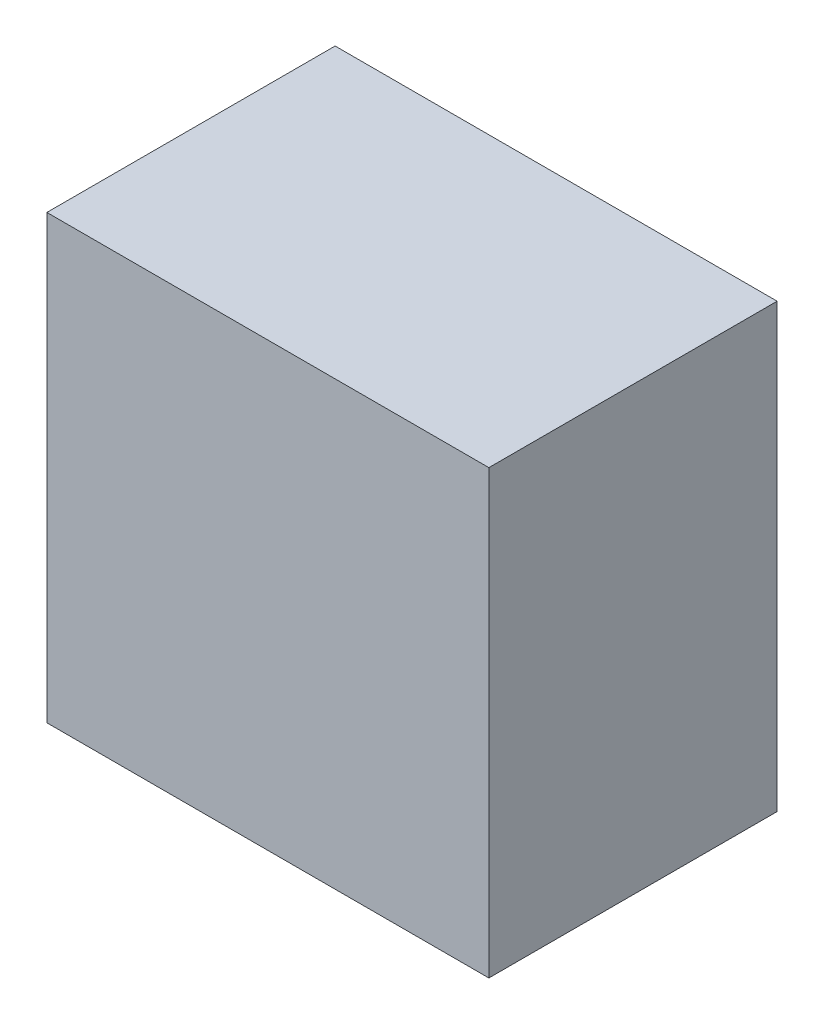
ISO-10303-21;
HEADER;
FILE_DESCRIPTION(('STEP AP214'),'2;1');
FILE_NAME('part.step','',(''),(''),'','','');
FILE_SCHEMA(('AUTOMOTIVE_DESIGN { 1 0 10303 214 1 1 1 1 }'));
ENDSEC;
DATA;
#1=APPLICATION_CONTEXT('core data for automotive mechanical design processes');
#2=APPLICATION_PROTOCOL_DEFINITION('international standard','automotive_design',2000,#1);
#3=PRODUCT_CONTEXT('',#1,'mechanical');
#4=PRODUCT('Part','Part','',(#3));
#5=PRODUCT_RELATED_PRODUCT_CATEGORY('part','',(#4));
#6=PRODUCT_DEFINITION_FORMATION('','',#4);
#7=PRODUCT_DEFINITION_CONTEXT('part definition',#1,'design');
#8=PRODUCT_DEFINITION('design','',#6,#7);
#9=PRODUCT_DEFINITION_SHAPE('','',#8);
#10=(LENGTH_UNIT() NAMED_UNIT(*) SI_UNIT(.MILLI.,.METRE.));
#11=(NAMED_UNIT(*) PLANE_ANGLE_UNIT() SI_UNIT($,.RADIAN.));
#12=(NAMED_UNIT(*) SI_UNIT($,.STERADIAN.) SOLID_ANGLE_UNIT());
#13=UNCERTAINTY_MEASURE_WITH_UNIT(LENGTH_MEASURE(1.E-05),#10,'distance_accuracy_value','');
#14=(GEOMETRIC_REPRESENTATION_CONTEXT(3) GLOBAL_UNCERTAINTY_ASSIGNED_CONTEXT((#13)) GLOBAL_UNIT_ASSIGNED_CONTEXT((#10,
#11,#12)) REPRESENTATION_CONTEXT('',''));
#15=CARTESIAN_POINT('',(0.,0.,0.));
#16=DIRECTION('',(0.,0.,1.));
#17=DIRECTION('',(1.,0.,0.));
#18=AXIS2_PLACEMENT_3D('',#15,#16,#17);
#19=CARTESIAN_POINT('',(2.921,2.921,0.));
#20=DIRECTION('',(0.,0.,-1.));
#21=DIRECTION('',(-1.,0.,0.));
#22=AXIS2_PLACEMENT_3D('',#19,#20,#21);
#23=PLANE('',#22);
#24=DIRECTION('',(1.,0.,0.));
#25=VECTOR('',#24,1.);
#26=CARTESIAN_POINT('',(2.921,-2.921,0.));
#27=LINE('',#26,#25);
#28=CARTESIAN_POINT('',(-2.921,-2.921,0.));
#29=VERTEX_POINT('',#28);
#30=CARTESIAN_POINT('',(2.921,-2.921,0.));
#31=VERTEX_POINT('',#30);
#32=EDGE_CURVE('E54',#29,#31,#27,.T.);
#33=ORIENTED_EDGE('',*,*,#32,.F.);
#34=DIRECTION('',(0.,1.,0.));
#35=VECTOR('',#34,1.);
#36=CARTESIAN_POINT('',(-2.921,-2.921,0.));
#37=LINE('',#36,#35);
#38=CARTESIAN_POINT('',(-2.921,2.921,0.));
#39=VERTEX_POINT('',#38);
#40=EDGE_CURVE('E19',#39,#29,#37,.F.);
#41=ORIENTED_EDGE('',*,*,#40,.F.);
#42=DIRECTION('',(1.,0.,0.));
#43=VECTOR('',#42,1.);
#44=CARTESIAN_POINT('',(-2.921,2.921,0.));
#45=LINE('',#44,#43);
#46=CARTESIAN_POINT('',(2.921,2.921,0.));
#47=VERTEX_POINT('',#46);
#48=EDGE_CURVE('E79',#47,#39,#45,.F.);
#49=ORIENTED_EDGE('',*,*,#48,.F.);
#50=DIRECTION('',(0.,1.,0.));
#51=VECTOR('',#50,1.);
#52=CARTESIAN_POINT('',(2.921,2.921,0.));
#53=LINE('',#52,#51);
#54=EDGE_CURVE('E67',#31,#47,#53,.T.);
#55=ORIENTED_EDGE('',*,*,#54,.F.);
#56=EDGE_LOOP('',(#33,#41,#49,#55));
#57=FACE_BOUND('',#56,.T.);
#58=ADVANCED_FACE('F16',(#57),#23,.T.);
#59=CARTESIAN_POINT('',(-2.921,-2.921,3.81));
#60=DIRECTION('',(-1.,0.,0.));
#61=DIRECTION('',(0.,0.,1.));
#62=AXIS2_PLACEMENT_3D('',#59,#60,#61);
#63=PLANE('',#62);
#64=ORIENTED_EDGE('',*,*,#40,.T.);
#65=DIRECTION('',(0.,0.,-1.));
#66=VECTOR('',#65,1.);
#67=CARTESIAN_POINT('',(-2.921,-2.921,3.81));
#68=LINE('',#67,#66);
#69=CARTESIAN_POINT('',(-2.921,-2.921,3.81));
#70=VERTEX_POINT('',#69);
#71=EDGE_CURVE('E60',#70,#29,#68,.T.);
#72=ORIENTED_EDGE('',*,*,#71,.F.);
#73=DIRECTION('',(0.,1.,0.));
#74=VECTOR('',#73,1.);
#75=CARTESIAN_POINT('',(-2.921,2.921,3.81));
#76=LINE('',#75,#74);
#77=CARTESIAN_POINT('',(-2.921,2.921,3.81));
#78=VERTEX_POINT('',#77);
#79=EDGE_CURVE('E82',#78,#70,#76,.F.);
#80=ORIENTED_EDGE('',*,*,#79,.F.);
#81=DIRECTION('',(0.,0.,1.));
#82=VECTOR('',#81,1.);
#83=CARTESIAN_POINT('',(-2.921,2.921,3.81));
#84=LINE('',#83,#82);
#85=EDGE_CURVE('E63',#39,#78,#84,.T.);
#86=ORIENTED_EDGE('',*,*,#85,.F.);
#87=EDGE_LOOP('',(#64,#72,#80,#86));
#88=FACE_BOUND('',#87,.T.);
#89=ADVANCED_FACE('F59',(#88),#63,.T.);
#90=CARTESIAN_POINT('',(2.921,-2.921,3.81));
#91=DIRECTION('',(0.,-1.,0.));
#92=DIRECTION('',(0.,0.,-1.));
#93=AXIS2_PLACEMENT_3D('',#90,#91,#92);
#94=PLANE('',#93);
#95=ORIENTED_EDGE('',*,*,#32,.T.);
#96=DIRECTION('',(0.,0.,-1.));
#97=VECTOR('',#96,1.);
#98=CARTESIAN_POINT('',(2.921,-2.921,3.81));
#99=LINE('',#98,#97);
#100=CARTESIAN_POINT('',(2.921,-2.921,3.81));
#101=VERTEX_POINT('',#100);
#102=EDGE_CURVE('E69',#101,#31,#99,.T.);
#103=ORIENTED_EDGE('',*,*,#102,.F.);
#104=DIRECTION('',(1.,0.,0.));
#105=VECTOR('',#104,1.);
#106=CARTESIAN_POINT('',(2.921,-2.921,3.81));
#107=LINE('',#106,#105);
#108=EDGE_CURVE('E73',#70,#101,#107,.T.);
#109=ORIENTED_EDGE('',*,*,#108,.F.);
#110=ORIENTED_EDGE('',*,*,#71,.T.);
#111=EDGE_LOOP('',(#95,#103,#109,#110));
#112=FACE_BOUND('',#111,.T.);
#113=ADVANCED_FACE('F71',(#112),#94,.T.);
#114=CARTESIAN_POINT('',(2.921,2.921,3.81));
#115=DIRECTION('',(1.,0.,0.));
#116=DIRECTION('',(0.,0.,-1.));
#117=AXIS2_PLACEMENT_3D('',#114,#115,#116);
#118=PLANE('',#117);
#119=ORIENTED_EDGE('',*,*,#54,.T.);
#120=DIRECTION('',(0.,0.,1.));
#121=VECTOR('',#120,1.);
#122=CARTESIAN_POINT('',(2.921,2.921,3.81));
#123=LINE('',#122,#121);
#124=CARTESIAN_POINT('',(2.921,2.921,3.81));
#125=VERTEX_POINT('',#124);
#126=EDGE_CURVE('E34',#125,#47,#123,.F.);
#127=ORIENTED_EDGE('',*,*,#126,.F.);
#128=DIRECTION('',(0.,1.,0.));
#129=VECTOR('',#128,1.);
#130=CARTESIAN_POINT('',(2.921,2.921,3.81));
#131=LINE('',#130,#129);
#132=EDGE_CURVE('E25',#101,#125,#131,.T.);
#133=ORIENTED_EDGE('',*,*,#132,.F.);
#134=ORIENTED_EDGE('',*,*,#102,.T.);
#135=EDGE_LOOP('',(#119,#127,#133,#134));
#136=FACE_BOUND('',#135,.T.);
#137=ADVANCED_FACE('F88',(#136),#118,.T.);
#138=CARTESIAN_POINT('',(-2.921,2.921,3.81));
#139=DIRECTION('',(0.,1.,0.));
#140=DIRECTION('',(0.,0.,1.));
#141=AXIS2_PLACEMENT_3D('',#138,#139,#140);
#142=PLANE('',#141);
#143=ORIENTED_EDGE('',*,*,#48,.T.);
#144=ORIENTED_EDGE('',*,*,#85,.T.);
#145=DIRECTION('',(1.,0.,0.));
#146=VECTOR('',#145,1.);
#147=CARTESIAN_POINT('',(2.921,2.921,3.81));
#148=LINE('',#147,#146);
#149=EDGE_CURVE('E11',#125,#78,#148,.F.);
#150=ORIENTED_EDGE('',*,*,#149,.F.);
#151=ORIENTED_EDGE('',*,*,#126,.T.);
#152=EDGE_LOOP('',(#143,#144,#150,#151));
#153=FACE_BOUND('',#152,.T.);
#154=ADVANCED_FACE('F90',(#153),#142,.T.);
#155=CARTESIAN_POINT('',(2.921,2.921,3.81));
#156=DIRECTION('',(0.,0.,1.));
#157=DIRECTION('',(1.,0.,0.));
#158=AXIS2_PLACEMENT_3D('',#155,#156,#157);
#159=PLANE('',#158);
#160=ORIENTED_EDGE('',*,*,#132,.T.);
#161=ORIENTED_EDGE('',*,*,#149,.T.);
#162=ORIENTED_EDGE('',*,*,#79,.T.);
#163=ORIENTED_EDGE('',*,*,#108,.T.);
#164=EDGE_LOOP('',(#160,#161,#162,#163));
#165=FACE_BOUND('',#164,.T.);
#166=ADVANCED_FACE('F87',(#165),#159,.T.);
#167=CLOSED_SHELL('',(#58,#89,#113,#137,#154,#166));
#168=MANIFOLD_SOLID_BREP('B1',#167);
#169=ADVANCED_BREP_SHAPE_REPRESENTATION('',(#18,#168),#14);
#170=SHAPE_DEFINITION_REPRESENTATION(#9,#169);
ENDSEC;
END-ISO-10303-21;
